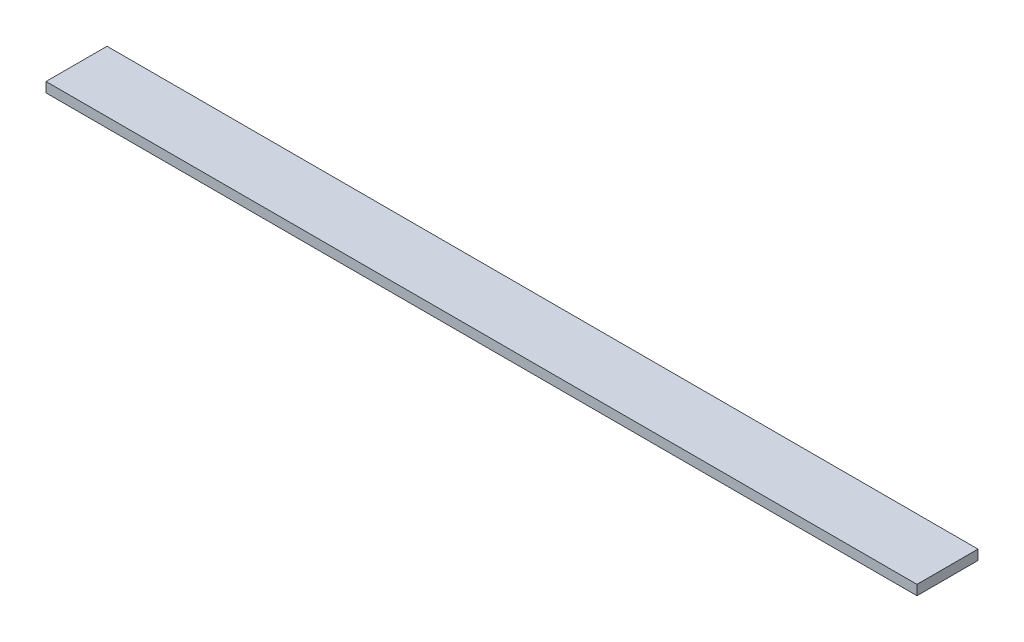
ISO-10303-21;
HEADER;
FILE_DESCRIPTION(('STEP AP214'),'2;1');
FILE_NAME('part.step','',(''),(''),'','','');
FILE_SCHEMA(('AUTOMOTIVE_DESIGN { 1 0 10303 214 1 1 1 1 }'));
ENDSEC;
DATA;
#1=APPLICATION_CONTEXT('core data for automotive mechanical design processes');
#2=APPLICATION_PROTOCOL_DEFINITION('international standard','automotive_design',2000,#1);
#3=PRODUCT_CONTEXT('',#1,'mechanical');
#4=PRODUCT('Part','Part','',(#3));
#5=PRODUCT_RELATED_PRODUCT_CATEGORY('part','',(#4));
#6=PRODUCT_DEFINITION_FORMATION('','',#4);
#7=PRODUCT_DEFINITION_CONTEXT('part definition',#1,'design');
#8=PRODUCT_DEFINITION('design','',#6,#7);
#9=PRODUCT_DEFINITION_SHAPE('','',#8);
#10=(LENGTH_UNIT() NAMED_UNIT(*) SI_UNIT(.MILLI.,.METRE.));
#11=(NAMED_UNIT(*) PLANE_ANGLE_UNIT() SI_UNIT($,.RADIAN.));
#12=(NAMED_UNIT(*) SI_UNIT($,.STERADIAN.) SOLID_ANGLE_UNIT());
#13=UNCERTAINTY_MEASURE_WITH_UNIT(LENGTH_MEASURE(1.E-05),#10,'distance_accuracy_value','');
#14=(GEOMETRIC_REPRESENTATION_CONTEXT(3) GLOBAL_UNCERTAINTY_ASSIGNED_CONTEXT((#13)) GLOBAL_UNIT_ASSIGNED_CONTEXT((#10,
#11,#12)) REPRESENTATION_CONTEXT('',''));
#15=CARTESIAN_POINT('',(0.,0.,0.));
#16=DIRECTION('',(0.,0.,1.));
#17=DIRECTION('',(1.,0.,0.));
#18=AXIS2_PLACEMENT_3D('',#15,#16,#17);
#19=CARTESIAN_POINT('',(-1312.25594149909,38.1,-579.510054844607));
#20=DIRECTION('',(1.,0.,0.));
#21=DIRECTION('',(0.,0.,-1.));
#22=AXIS2_PLACEMENT_3D('',#19,#20,#21);
#23=PLANE('',#22);
#24=DIRECTION('',(0.,0.,1.));
#25=VECTOR('',#24,1.);
#26=CARTESIAN_POINT('',(-1312.25594149909,0.,-579.510054844607));
#27=LINE('',#26,#25);
#28=CARTESIAN_POINT('',(-1312.25594149909,0.,-579.510054844607));
#29=VERTEX_POINT('',#28);
#30=CARTESIAN_POINT('',(-1312.25594149909,0.,-344.560054844607));
#31=VERTEX_POINT('',#30);
#32=EDGE_CURVE('E96',#29,#31,#27,.T.);
#33=ORIENTED_EDGE('',*,*,#32,.T.);
#34=DIRECTION('',(0.,-1.,0.));
#35=VECTOR('',#34,1.);
#36=CARTESIAN_POINT('',(-1312.25594149909,38.1,-344.560054844607));
#37=LINE('',#36,#35);
#38=CARTESIAN_POINT('',(-1312.25594149909,38.1,-344.560054844607));
#39=VERTEX_POINT('',#38);
#40=EDGE_CURVE('E11',#39,#31,#37,.T.);
#41=ORIENTED_EDGE('',*,*,#40,.F.);
#42=DIRECTION('',(0.,0.,1.));
#43=VECTOR('',#42,1.);
#44=CARTESIAN_POINT('',(-1312.25594149909,38.1,-579.510054844607));
#45=LINE('',#44,#43);
#46=CARTESIAN_POINT('',(-1312.25594149909,38.1,-579.510054844607));
#47=VERTEX_POINT('',#46);
#48=EDGE_CURVE('E84',#47,#39,#45,.T.);
#49=ORIENTED_EDGE('',*,*,#48,.F.);
#50=DIRECTION('',(0.,-1.,0.));
#51=VECTOR('',#50,1.);
#52=CARTESIAN_POINT('',(-1312.25594149909,38.1,-579.510054844607));
#53=LINE('',#52,#51);
#54=EDGE_CURVE('E92',#47,#29,#53,.T.);
#55=ORIENTED_EDGE('',*,*,#54,.T.);
#56=EDGE_LOOP('',(#33,#41,#49,#55));
#57=FACE_BOUND('',#56,.T.);
#58=ADVANCED_FACE('F33',(#57),#23,.F.);
#59=CARTESIAN_POINT('',(-1312.25594149909,38.1,-344.560054844607));
#60=DIRECTION('',(0.,0.,-1.));
#61=DIRECTION('',(-1.,0.,0.));
#62=AXIS2_PLACEMENT_3D('',#59,#60,#61);
#63=PLANE('',#62);
#64=DIRECTION('',(1.,0.,0.));
#65=VECTOR('',#64,1.);
#66=CARTESIAN_POINT('',(-1312.25594149909,0.,-344.560054844607));
#67=LINE('',#66,#65);
#68=CARTESIAN_POINT('',(2040.54405850091,0.,-344.560054844607));
#69=VERTEX_POINT('',#68);
#70=EDGE_CURVE('E88',#31,#69,#67,.T.);
#71=ORIENTED_EDGE('',*,*,#70,.T.);
#72=DIRECTION('',(0.,-1.,0.));
#73=VECTOR('',#72,1.);
#74=CARTESIAN_POINT('',(2040.54405850091,38.1,-344.560054844607));
#75=LINE('',#74,#73);
#76=CARTESIAN_POINT('',(2040.54405850091,38.1,-344.560054844607));
#77=VERTEX_POINT('',#76);
#78=EDGE_CURVE('E41',#77,#69,#75,.T.);
#79=ORIENTED_EDGE('',*,*,#78,.F.);
#80=DIRECTION('',(1.,0.,0.));
#81=VECTOR('',#80,1.);
#82=CARTESIAN_POINT('',(-1312.25594149909,38.1,-344.560054844607));
#83=LINE('',#82,#81);
#84=EDGE_CURVE('E79',#39,#77,#83,.T.);
#85=ORIENTED_EDGE('',*,*,#84,.F.);
#86=ORIENTED_EDGE('',*,*,#40,.T.);
#87=EDGE_LOOP('',(#71,#79,#85,#86));
#88=FACE_BOUND('',#87,.T.);
#89=ADVANCED_FACE('F87',(#88),#63,.F.);
#90=CARTESIAN_POINT('',(2040.54405850091,38.1,-579.510054844607));
#91=DIRECTION('',(-1.,0.,0.));
#92=DIRECTION('',(0.,0.,1.));
#93=AXIS2_PLACEMENT_3D('',#90,#91,#92);
#94=PLANE('',#93);
#95=DIRECTION('',(0.,0.,-1.));
#96=VECTOR('',#95,1.);
#97=CARTESIAN_POINT('',(2040.54405850091,0.,-579.510054844607));
#98=LINE('',#97,#96);
#99=CARTESIAN_POINT('',(2040.54405850091,0.,-579.510054844607));
#100=VERTEX_POINT('',#99);
#101=EDGE_CURVE('E66',#69,#100,#98,.T.);
#102=ORIENTED_EDGE('',*,*,#101,.T.);
#103=DIRECTION('',(0.,-1.,0.));
#104=VECTOR('',#103,1.);
#105=CARTESIAN_POINT('',(2040.54405850091,38.1,-579.510054844607));
#106=LINE('',#105,#104);
#107=CARTESIAN_POINT('',(2040.54405850091,38.1,-579.510054844607));
#108=VERTEX_POINT('',#107);
#109=EDGE_CURVE('E89',#108,#100,#106,.T.);
#110=ORIENTED_EDGE('',*,*,#109,.F.);
#111=DIRECTION('',(0.,0.,-1.));
#112=VECTOR('',#111,1.);
#113=CARTESIAN_POINT('',(2040.54405850091,38.1,-579.510054844607));
#114=LINE('',#113,#112);
#115=EDGE_CURVE('E82',#77,#108,#114,.T.);
#116=ORIENTED_EDGE('',*,*,#115,.F.);
#117=ORIENTED_EDGE('',*,*,#78,.T.);
#118=EDGE_LOOP('',(#102,#110,#116,#117));
#119=FACE_BOUND('',#118,.T.);
#120=ADVANCED_FACE('F90',(#119),#94,.F.);
#121=CARTESIAN_POINT('',(-1312.25594149909,38.1,-579.510054844607));
#122=DIRECTION('',(0.,0.,1.));
#123=DIRECTION('',(1.,0.,0.));
#124=AXIS2_PLACEMENT_3D('',#121,#122,#123);
#125=PLANE('',#124);
#126=DIRECTION('',(-1.,0.,0.));
#127=VECTOR('',#126,1.);
#128=CARTESIAN_POINT('',(-1312.25594149909,0.,-579.510054844607));
#129=LINE('',#128,#127);
#130=EDGE_CURVE('E72',#100,#29,#129,.T.);
#131=ORIENTED_EDGE('',*,*,#130,.T.);
#132=ORIENTED_EDGE('',*,*,#54,.F.);
#133=DIRECTION('',(-1.,0.,0.));
#134=VECTOR('',#133,1.);
#135=CARTESIAN_POINT('',(-1312.25594149909,38.1,-579.510054844607));
#136=LINE('',#135,#134);
#137=EDGE_CURVE('E49',#108,#47,#136,.T.);
#138=ORIENTED_EDGE('',*,*,#137,.F.);
#139=ORIENTED_EDGE('',*,*,#109,.T.);
#140=EDGE_LOOP('',(#131,#132,#138,#139));
#141=FACE_BOUND('',#140,.T.);
#142=ADVANCED_FACE('F103',(#141),#125,.F.);
#143=CARTESIAN_POINT('',(0.,38.1,0.));
#144=DIRECTION('',(0.,1.,0.));
#145=DIRECTION('',(0.,0.,1.));
#146=AXIS2_PLACEMENT_3D('',#143,#144,#145);
#147=PLANE('',#146);
#148=ORIENTED_EDGE('',*,*,#48,.T.);
#149=ORIENTED_EDGE('',*,*,#84,.T.);
#150=ORIENTED_EDGE('',*,*,#115,.T.);
#151=ORIENTED_EDGE('',*,*,#137,.T.);
#152=EDGE_LOOP('',(#148,#149,#150,#151));
#153=FACE_BOUND('',#152,.T.);
#154=ADVANCED_FACE('F80',(#153),#147,.T.);
#155=CARTESIAN_POINT('',(0.,0.,0.));
#156=DIRECTION('',(0.,1.,0.));
#157=DIRECTION('',(0.,0.,1.));
#158=AXIS2_PLACEMENT_3D('',#155,#156,#157);
#159=PLANE('',#158);
#160=ORIENTED_EDGE('',*,*,#32,.F.);
#161=ORIENTED_EDGE('',*,*,#130,.F.);
#162=ORIENTED_EDGE('',*,*,#101,.F.);
#163=ORIENTED_EDGE('',*,*,#70,.F.);
#164=EDGE_LOOP('',(#160,#161,#162,#163));
#165=FACE_BOUND('',#164,.T.);
#166=ADVANCED_FACE('F106',(#165),#159,.F.);
#167=CLOSED_SHELL('',(#58,#89,#120,#142,#154,#166));
#168=MANIFOLD_SOLID_BREP('B2',#167);
#169=ADVANCED_BREP_SHAPE_REPRESENTATION('',(#18,#168),#14);
#170=SHAPE_DEFINITION_REPRESENTATION(#9,#169);
ENDSEC;
END-ISO-10303-21;
